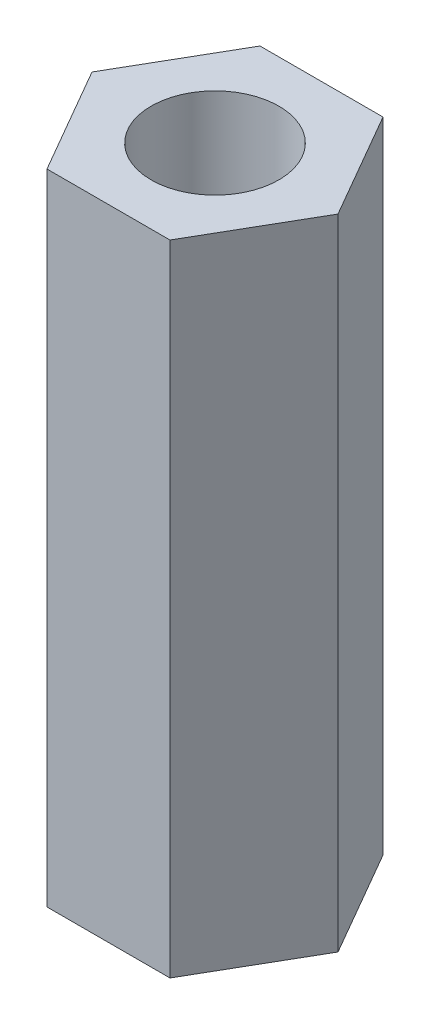
ISO-10303-21;
HEADER;
FILE_DESCRIPTION(('STEP AP214'),'2;1');
FILE_NAME('part.step','',(''),(''),'','','');
FILE_SCHEMA(('AUTOMOTIVE_DESIGN { 1 0 10303 214 1 1 1 1 }'));
ENDSEC;
DATA;
#1=APPLICATION_CONTEXT('core data for automotive mechanical design processes');
#2=APPLICATION_PROTOCOL_DEFINITION('international standard','automotive_design',2000,#1);
#3=PRODUCT_CONTEXT('',#1,'mechanical');
#4=PRODUCT('Part','Part','',(#3));
#5=PRODUCT_RELATED_PRODUCT_CATEGORY('part','',(#4));
#6=PRODUCT_DEFINITION_FORMATION('','',#4);
#7=PRODUCT_DEFINITION_CONTEXT('part definition',#1,'design');
#8=PRODUCT_DEFINITION('design','',#6,#7);
#9=PRODUCT_DEFINITION_SHAPE('','',#8);
#10=(LENGTH_UNIT() NAMED_UNIT(*) SI_UNIT(.MILLI.,.METRE.));
#11=(NAMED_UNIT(*) PLANE_ANGLE_UNIT() SI_UNIT($,.RADIAN.));
#12=(NAMED_UNIT(*) SI_UNIT($,.STERADIAN.) SOLID_ANGLE_UNIT());
#13=UNCERTAINTY_MEASURE_WITH_UNIT(LENGTH_MEASURE(1.E-05),#10,'distance_accuracy_value','');
#14=(GEOMETRIC_REPRESENTATION_CONTEXT(3) GLOBAL_UNCERTAINTY_ASSIGNED_CONTEXT((#13)) GLOBAL_UNIT_ASSIGNED_CONTEXT((#10,
#11,#12)) REPRESENTATION_CONTEXT('',''));
#15=CARTESIAN_POINT('',(0.,0.,0.));
#16=DIRECTION('',(0.,0.,1.));
#17=DIRECTION('',(1.,0.,0.));
#18=AXIS2_PLACEMENT_3D('',#15,#16,#17);
#19=CARTESIAN_POINT('',(0.,7.5,0.));
#20=DIRECTION('',(0.,1.,0.));
#21=DIRECTION('',(0.,0.,1.));
#22=AXIS2_PLACEMENT_3D('',#19,#20,#21);
#23=PLANE('',#22);
#24=DIRECTION('',(1.,0.,0.));
#25=VECTOR('',#24,1.);
#26=CARTESIAN_POINT('',(-1.44337567297405,7.5,2.5));
#27=LINE('',#26,#25);
#28=CARTESIAN_POINT('',(-1.44337567297405,7.5,2.5));
#29=VERTEX_POINT('',#28);
#30=CARTESIAN_POINT('',(1.44337567297408,7.5,2.5));
#31=VERTEX_POINT('',#30);
#32=EDGE_CURVE('E129',#29,#31,#27,.T.);
#33=ORIENTED_EDGE('',*,*,#32,.T.);
#34=DIRECTION('',(0.500000000000001,0.,-0.866025403784438));
#35=VECTOR('',#34,1.);
#36=CARTESIAN_POINT('',(1.44337567297408,7.5,2.5));
#37=LINE('',#36,#35);
#38=CARTESIAN_POINT('',(2.88675134594815,7.5,0.));
#39=VERTEX_POINT('',#38);
#40=EDGE_CURVE('E87',#31,#39,#37,.T.);
#41=ORIENTED_EDGE('',*,*,#40,.T.);
#42=DIRECTION('',(-0.500000000000001,0.,-0.866025403784438));
#43=VECTOR('',#42,1.);
#44=CARTESIAN_POINT('',(2.88675134594815,7.5,0.));
#45=LINE('',#44,#43);
#46=CARTESIAN_POINT('',(1.44337567297408,7.5,-2.50000000000001));
#47=VERTEX_POINT('',#46);
#48=EDGE_CURVE('E100',#39,#47,#45,.T.);
#49=ORIENTED_EDGE('',*,*,#48,.T.);
#50=DIRECTION('',(-1.,0.,0.));
#51=VECTOR('',#50,1.);
#52=CARTESIAN_POINT('',(1.44337567297408,7.5,-2.50000000000001));
#53=LINE('',#52,#51);
#54=CARTESIAN_POINT('',(-1.44337567297405,7.5,-2.50000000000001));
#55=VERTEX_POINT('',#54);
#56=EDGE_CURVE('E94',#47,#55,#53,.T.);
#57=ORIENTED_EDGE('',*,*,#56,.T.);
#58=DIRECTION('',(-0.5,0.,0.866025403784438));
#59=VECTOR('',#58,1.);
#60=CARTESIAN_POINT('',(-1.44337567297405,7.5,-2.50000000000001));
#61=LINE('',#60,#59);
#62=CARTESIAN_POINT('',(-2.88675134594812,7.5,0.));
#63=VERTEX_POINT('',#62);
#64=EDGE_CURVE('E98',#55,#63,#61,.T.);
#65=ORIENTED_EDGE('',*,*,#64,.T.);
#66=DIRECTION('',(0.5,0.,0.866025403784438));
#67=VECTOR('',#66,1.);
#68=CARTESIAN_POINT('',(-2.88675134594812,7.5,0.));
#69=LINE('',#68,#67);
#70=EDGE_CURVE('E50',#63,#29,#69,.T.);
#71=ORIENTED_EDGE('',*,*,#70,.T.);
#72=EDGE_LOOP('',(#33,#41,#49,#57,#65,#71));
#73=FACE_BOUND('',#72,.T.);
#74=CARTESIAN_POINT('',(0.,7.5,0.));
#75=DIRECTION('',(0.,1.,0.));
#76=DIRECTION('',(0.,0.,1.));
#77=AXIS2_PLACEMENT_3D('',#74,#75,#76);
#78=CIRCLE('',#77,1.5);
#79=CARTESIAN_POINT('',(0.,7.5,1.5));
#80=VERTEX_POINT('',#79);
#81=EDGE_CURVE('E122',#80,#80,#78,.T.);
#82=ORIENTED_EDGE('',*,*,#81,.F.);
#83=EDGE_LOOP('',(#82));
#84=FACE_BOUND('',#83,.T.);
#85=ADVANCED_FACE('F33',(#73,#84),#23,.T.);
#86=CARTESIAN_POINT('',(0.,-7.5,0.));
#87=DIRECTION('',(0.,1.,0.));
#88=DIRECTION('',(0.,0.,1.));
#89=AXIS2_PLACEMENT_3D('',#86,#87,#88);
#90=PLANE('',#89);
#91=DIRECTION('',(1.,0.,0.));
#92=VECTOR('',#91,1.);
#93=CARTESIAN_POINT('',(-1.44337567297405,-7.5,2.5));
#94=LINE('',#93,#92);
#95=CARTESIAN_POINT('',(-1.44337567297405,-7.5,2.5));
#96=VERTEX_POINT('',#95);
#97=CARTESIAN_POINT('',(1.44337567297408,-7.5,2.5));
#98=VERTEX_POINT('',#97);
#99=EDGE_CURVE('E118',#96,#98,#94,.T.);
#100=ORIENTED_EDGE('',*,*,#99,.F.);
#101=DIRECTION('',(0.5,0.,0.866025403784438));
#102=VECTOR('',#101,1.);
#103=CARTESIAN_POINT('',(-2.88675134594812,-7.5,0.));
#104=LINE('',#103,#102);
#105=CARTESIAN_POINT('',(-2.88675134594812,-7.5,0.));
#106=VERTEX_POINT('',#105);
#107=EDGE_CURVE('E79',#106,#96,#104,.T.);
#108=ORIENTED_EDGE('',*,*,#107,.F.);
#109=DIRECTION('',(-0.5,0.,0.866025403784438));
#110=VECTOR('',#109,1.);
#111=CARTESIAN_POINT('',(-1.44337567297405,-7.5,-2.50000000000001));
#112=LINE('',#111,#110);
#113=CARTESIAN_POINT('',(-1.44337567297405,-7.5,-2.50000000000001));
#114=VERTEX_POINT('',#113);
#115=EDGE_CURVE('E73',#114,#106,#112,.T.);
#116=ORIENTED_EDGE('',*,*,#115,.F.);
#117=DIRECTION('',(-1.,0.,0.));
#118=VECTOR('',#117,1.);
#119=CARTESIAN_POINT('',(1.44337567297408,-7.5,-2.50000000000001));
#120=LINE('',#119,#118);
#121=CARTESIAN_POINT('',(1.44337567297408,-7.5,-2.50000000000001));
#122=VERTEX_POINT('',#121);
#123=EDGE_CURVE('E108',#122,#114,#120,.T.);
#124=ORIENTED_EDGE('',*,*,#123,.F.);
#125=DIRECTION('',(-0.500000000000001,0.,-0.866025403784438));
#126=VECTOR('',#125,1.);
#127=CARTESIAN_POINT('',(2.88675134594815,-7.5,0.));
#128=LINE('',#127,#126);
#129=CARTESIAN_POINT('',(2.88675134594815,-7.5,0.));
#130=VERTEX_POINT('',#129);
#131=EDGE_CURVE('E124',#130,#122,#128,.T.);
#132=ORIENTED_EDGE('',*,*,#131,.F.);
#133=DIRECTION('',(0.500000000000001,0.,-0.866025403784438));
#134=VECTOR('',#133,1.);
#135=CARTESIAN_POINT('',(1.44337567297408,-7.5,2.5));
#136=LINE('',#135,#134);
#137=EDGE_CURVE('E121',#98,#130,#136,.T.);
#138=ORIENTED_EDGE('',*,*,#137,.F.);
#139=EDGE_LOOP('',(#100,#108,#116,#124,#132,#138));
#140=FACE_BOUND('',#139,.T.);
#141=CARTESIAN_POINT('',(0.,-7.5,0.));
#142=DIRECTION('',(0.,1.,0.));
#143=DIRECTION('',(0.,0.,1.));
#144=AXIS2_PLACEMENT_3D('',#141,#142,#143);
#145=CIRCLE('',#144,1.5);
#146=CARTESIAN_POINT('',(0.,-7.5,1.5));
#147=VERTEX_POINT('',#146);
#148=EDGE_CURVE('E222',#147,#147,#145,.T.);
#149=ORIENTED_EDGE('',*,*,#148,.T.);
#150=EDGE_LOOP('',(#149));
#151=FACE_BOUND('',#150,.T.);
#152=ADVANCED_FACE('F138',(#140,#151),#90,.F.);
#153=CARTESIAN_POINT('',(-1.44337567297405,7.5,2.5));
#154=DIRECTION('',(0.,0.,-1.));
#155=DIRECTION('',(-1.,0.,0.));
#156=AXIS2_PLACEMENT_3D('',#153,#154,#155);
#157=PLANE('',#156);
#158=ORIENTED_EDGE('',*,*,#99,.T.);
#159=DIRECTION('',(0.,-1.,0.));
#160=VECTOR('',#159,1.);
#161=CARTESIAN_POINT('',(1.44337567297408,7.5,2.5));
#162=LINE('',#161,#160);
#163=EDGE_CURVE('E11',#31,#98,#162,.T.);
#164=ORIENTED_EDGE('',*,*,#163,.F.);
#165=ORIENTED_EDGE('',*,*,#32,.F.);
#166=DIRECTION('',(0.,-1.,0.));
#167=VECTOR('',#166,1.);
#168=CARTESIAN_POINT('',(-1.44337567297405,7.5,2.5));
#169=LINE('',#168,#167);
#170=EDGE_CURVE('E114',#29,#96,#169,.T.);
#171=ORIENTED_EDGE('',*,*,#170,.T.);
#172=EDGE_LOOP('',(#158,#164,#165,#171));
#173=FACE_BOUND('',#172,.T.);
#174=ADVANCED_FACE('F35',(#173),#157,.F.);
#175=CARTESIAN_POINT('',(1.44337567297408,7.5,2.5));
#176=DIRECTION('',(-0.866025403784438,0.,-0.500000000000001));
#177=DIRECTION('',(-0.500000000000001,0.,0.866025403784438));
#178=AXIS2_PLACEMENT_3D('',#175,#176,#177);
#179=PLANE('',#178);
#180=ORIENTED_EDGE('',*,*,#137,.T.);
#181=DIRECTION('',(0.,-1.,0.));
#182=VECTOR('',#181,1.);
#183=CARTESIAN_POINT('',(2.88675134594815,7.5,0.));
#184=LINE('',#183,#182);
#185=EDGE_CURVE('E42',#39,#130,#184,.T.);
#186=ORIENTED_EDGE('',*,*,#185,.F.);
#187=ORIENTED_EDGE('',*,*,#40,.F.);
#188=ORIENTED_EDGE('',*,*,#163,.T.);
#189=EDGE_LOOP('',(#180,#186,#187,#188));
#190=FACE_BOUND('',#189,.T.);
#191=ADVANCED_FACE('F163',(#190),#179,.F.);
#192=CARTESIAN_POINT('',(2.88675134594815,7.5,0.));
#193=DIRECTION('',(-0.866025403784438,0.,0.500000000000001));
#194=DIRECTION('',(0.500000000000001,0.,0.866025403784438));
#195=AXIS2_PLACEMENT_3D('',#192,#193,#194);
#196=PLANE('',#195);
#197=ORIENTED_EDGE('',*,*,#131,.T.);
#198=DIRECTION('',(0.,-1.,0.));
#199=VECTOR('',#198,1.);
#200=CARTESIAN_POINT('',(1.44337567297408,7.5,-2.50000000000001));
#201=LINE('',#200,#199);
#202=EDGE_CURVE('E109',#47,#122,#201,.T.);
#203=ORIENTED_EDGE('',*,*,#202,.F.);
#204=ORIENTED_EDGE('',*,*,#48,.F.);
#205=ORIENTED_EDGE('',*,*,#185,.T.);
#206=EDGE_LOOP('',(#197,#203,#204,#205));
#207=FACE_BOUND('',#206,.T.);
#208=ADVANCED_FACE('F135',(#207),#196,.F.);
#209=CARTESIAN_POINT('',(1.44337567297408,7.5,-2.50000000000001));
#210=DIRECTION('',(0.,0.,1.));
#211=DIRECTION('',(1.,0.,0.));
#212=AXIS2_PLACEMENT_3D('',#209,#210,#211);
#213=PLANE('',#212);
#214=ORIENTED_EDGE('',*,*,#123,.T.);
#215=DIRECTION('',(0.,-1.,0.));
#216=VECTOR('',#215,1.);
#217=CARTESIAN_POINT('',(-1.44337567297405,7.5,-2.50000000000001));
#218=LINE('',#217,#216);
#219=EDGE_CURVE('E105',#55,#114,#218,.T.);
#220=ORIENTED_EDGE('',*,*,#219,.F.);
#221=ORIENTED_EDGE('',*,*,#56,.F.);
#222=ORIENTED_EDGE('',*,*,#202,.T.);
#223=EDGE_LOOP('',(#214,#220,#221,#222));
#224=FACE_BOUND('',#223,.T.);
#225=ADVANCED_FACE('F106',(#224),#213,.F.);
#226=CARTESIAN_POINT('',(-1.44337567297405,7.5,-2.50000000000001));
#227=DIRECTION('',(0.866025403784439,0.,0.5));
#228=DIRECTION('',(0.5,0.,-0.866025403784439));
#229=AXIS2_PLACEMENT_3D('',#226,#227,#228);
#230=PLANE('',#229);
#231=ORIENTED_EDGE('',*,*,#115,.T.);
#232=DIRECTION('',(0.,-1.,0.));
#233=VECTOR('',#232,1.);
#234=CARTESIAN_POINT('',(-2.88675134594812,7.5,0.));
#235=LINE('',#234,#233);
#236=EDGE_CURVE('E110',#63,#106,#235,.T.);
#237=ORIENTED_EDGE('',*,*,#236,.F.);
#238=ORIENTED_EDGE('',*,*,#64,.F.);
#239=ORIENTED_EDGE('',*,*,#219,.T.);
#240=EDGE_LOOP('',(#231,#237,#238,#239));
#241=FACE_BOUND('',#240,.T.);
#242=ADVANCED_FACE('F112',(#241),#230,.F.);
#243=CARTESIAN_POINT('',(-2.88675134594812,7.5,0.));
#244=DIRECTION('',(0.866025403784438,0.,-0.5));
#245=DIRECTION('',(-0.5,0.,-0.866025403784438));
#246=AXIS2_PLACEMENT_3D('',#243,#244,#245);
#247=PLANE('',#246);
#248=ORIENTED_EDGE('',*,*,#107,.T.);
#249=ORIENTED_EDGE('',*,*,#170,.F.);
#250=ORIENTED_EDGE('',*,*,#70,.F.);
#251=ORIENTED_EDGE('',*,*,#236,.T.);
#252=EDGE_LOOP('',(#248,#249,#250,#251));
#253=FACE_BOUND('',#252,.T.);
#254=ADVANCED_FACE('F143',(#253),#247,.F.);
#255=CARTESIAN_POINT('',(0.,7.5,0.));
#256=DIRECTION('',(0.,-1.,0.));
#257=DIRECTION('',(0.,0.,-1.));
#258=AXIS2_PLACEMENT_3D('',#255,#256,#257);
#259=CYLINDRICAL_SURFACE('',#258,1.5);
#260=ORIENTED_EDGE('',*,*,#81,.T.);
#261=EDGE_LOOP('',(#260));
#262=FACE_BOUND('',#261,.T.);
#263=ORIENTED_EDGE('',*,*,#148,.F.);
#264=EDGE_LOOP('',(#263));
#265=FACE_BOUND('',#264,.T.);
#266=ADVANCED_FACE('F145',(#262,#265),#259,.F.);
#267=CLOSED_SHELL('',(#85,#152,#174,#191,#208,#225,#242,#254,#266));
#268=MANIFOLD_SOLID_BREP('B2',#267);
#269=ADVANCED_BREP_SHAPE_REPRESENTATION('',(#18,#268),#14);
#270=SHAPE_DEFINITION_REPRESENTATION(#9,#269);
ENDSEC;
END-ISO-10303-21;
